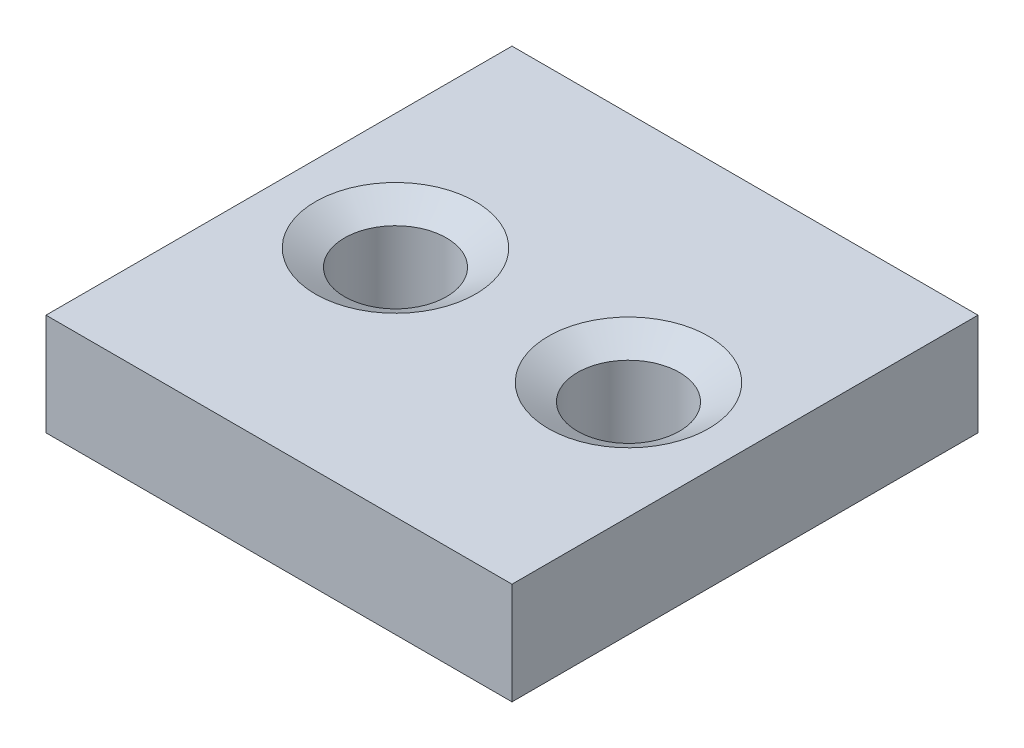
ISO-10303-21;
HEADER;
FILE_DESCRIPTION(('STEP AP214'),'2;1');
FILE_NAME('part.step','',(''),(''),'','','');
FILE_SCHEMA(('AUTOMOTIVE_DESIGN { 1 0 10303 214 1 1 1 1 }'));
ENDSEC;
DATA;
#1=APPLICATION_CONTEXT('core data for automotive mechanical design processes');
#2=APPLICATION_PROTOCOL_DEFINITION('international standard','automotive_design',2000,#1);
#3=PRODUCT_CONTEXT('',#1,'mechanical');
#4=PRODUCT('Part','Part','',(#3));
#5=PRODUCT_RELATED_PRODUCT_CATEGORY('part','',(#4));
#6=PRODUCT_DEFINITION_FORMATION('','',#4);
#7=PRODUCT_DEFINITION_CONTEXT('part definition',#1,'design');
#8=PRODUCT_DEFINITION('design','',#6,#7);
#9=PRODUCT_DEFINITION_SHAPE('','',#8);
#10=(LENGTH_UNIT() NAMED_UNIT(*) SI_UNIT(.MILLI.,.METRE.));
#11=(NAMED_UNIT(*) PLANE_ANGLE_UNIT() SI_UNIT($,.RADIAN.));
#12=(NAMED_UNIT(*) SI_UNIT($,.STERADIAN.) SOLID_ANGLE_UNIT());
#13=UNCERTAINTY_MEASURE_WITH_UNIT(LENGTH_MEASURE(1.E-05),#10,'distance_accuracy_value','');
#14=(GEOMETRIC_REPRESENTATION_CONTEXT(3) GLOBAL_UNCERTAINTY_ASSIGNED_CONTEXT((#13)) GLOBAL_UNIT_ASSIGNED_CONTEXT((#10,
#11,#12)) REPRESENTATION_CONTEXT('',''));
#15=CARTESIAN_POINT('',(0.,0.,0.));
#16=DIRECTION('',(0.,0.,1.));
#17=DIRECTION('',(1.,0.,0.));
#18=AXIS2_PLACEMENT_3D('',#15,#16,#17);
#19=CARTESIAN_POINT('',(0.,7.00000000000001,0.));
#20=DIRECTION('',(0.,1.,0.));
#21=DIRECTION('',(0.,0.,1.));
#22=AXIS2_PLACEMENT_3D('',#19,#20,#21);
#23=PLANE('',#22);
#24=CARTESIAN_POINT('',(8.00000000000001,7.00000000000001,0.));
#25=DIRECTION('',(0.,1.,0.));
#26=DIRECTION('',(0.,0.,1.));
#27=AXIS2_PLACEMENT_3D('',#24,#25,#26);
#28=CIRCLE('',#27,5.50000000000003);
#29=CARTESIAN_POINT('',(8.00000000000001,7.00000000000001,5.50000000000005));
#30=VERTEX_POINT('',#29);
#31=EDGE_CURVE('E59',#30,#30,#28,.F.);
#32=ORIENTED_EDGE('',*,*,#31,.T.);
#33=EDGE_LOOP('',(#32));
#34=FACE_BOUND('',#33,.T.);
#35=CARTESIAN_POINT('',(-8.00000000000001,7.00000000000001,0.));
#36=DIRECTION('',(0.,1.,0.));
#37=DIRECTION('',(0.,0.,1.));
#38=AXIS2_PLACEMENT_3D('',#35,#36,#37);
#39=CIRCLE('',#38,5.50000000000003);
#40=CARTESIAN_POINT('',(-8.00000000000001,7.00000000000001,5.50000000000005));
#41=VERTEX_POINT('',#40);
#42=EDGE_CURVE('E142',#41,#41,#39,.F.);
#43=ORIENTED_EDGE('',*,*,#42,.T.);
#44=EDGE_LOOP('',(#43));
#45=FACE_BOUND('',#44,.T.);
#46=DIRECTION('',(0.,0.,-1.));
#47=VECTOR('',#46,1.);
#48=CARTESIAN_POINT('',(15.9999999999988,7.00000000000001,-16.));
#49=LINE('',#48,#47);
#50=CARTESIAN_POINT('',(16.,7.00000000000001,16.));
#51=VERTEX_POINT('',#50);
#52=CARTESIAN_POINT('',(15.9999999999988,7.00000000000001,-16.));
#53=VERTEX_POINT('',#52);
#54=EDGE_CURVE('E101',#51,#53,#49,.T.);
#55=ORIENTED_EDGE('',*,*,#54,.T.);
#56=DIRECTION('',(-1.,0.,0.));
#57=VECTOR('',#56,1.);
#58=CARTESIAN_POINT('',(-16.0000000000012,7.00000000000001,-16.0000000000025));
#59=LINE('',#58,#57);
#60=CARTESIAN_POINT('',(-16.0000000000012,7.00000000000001,-16.0000000000025));
#61=VERTEX_POINT('',#60);
#62=EDGE_CURVE('E100',#53,#61,#59,.T.);
#63=ORIENTED_EDGE('',*,*,#62,.T.);
#64=DIRECTION('',(0.,0.,1.));
#65=VECTOR('',#64,1.);
#66=CARTESIAN_POINT('',(-16.0000000000012,7.00000000000001,-16.0000000000025));
#67=LINE('',#66,#65);
#68=CARTESIAN_POINT('',(-16.,7.00000000000001,15.9999999999976));
#69=VERTEX_POINT('',#68);
#70=EDGE_CURVE('E97',#61,#69,#67,.T.);
#71=ORIENTED_EDGE('',*,*,#70,.T.);
#72=DIRECTION('',(1.,0.,0.));
#73=VECTOR('',#72,1.);
#74=CARTESIAN_POINT('',(-16.,7.00000000000001,15.9999999999976));
#75=LINE('',#74,#73);
#76=EDGE_CURVE('E69',#69,#51,#75,.T.);
#77=ORIENTED_EDGE('',*,*,#76,.T.);
#78=EDGE_LOOP('',(#55,#63,#71,#77));
#79=FACE_BOUND('',#78,.T.);
#80=ADVANCED_FACE('F50',(#34,#45,#79),#23,.T.);
#81=CARTESIAN_POINT('',(0.,0.,0.));
#82=DIRECTION('',(0.,1.,0.));
#83=DIRECTION('',(0.,0.,1.));
#84=AXIS2_PLACEMENT_3D('',#81,#82,#83);
#85=PLANE('',#84);
#86=DIRECTION('',(0.,0.,-1.));
#87=VECTOR('',#86,1.);
#88=CARTESIAN_POINT('',(15.9999999999988,0.,-16.));
#89=LINE('',#88,#87);
#90=CARTESIAN_POINT('',(16.,0.,16.));
#91=VERTEX_POINT('',#90);
#92=CARTESIAN_POINT('',(15.9999999999988,0.,-16.));
#93=VERTEX_POINT('',#92);
#94=EDGE_CURVE('E124',#91,#93,#89,.T.);
#95=ORIENTED_EDGE('',*,*,#94,.F.);
#96=DIRECTION('',(1.,0.,0.));
#97=VECTOR('',#96,1.);
#98=CARTESIAN_POINT('',(-16.,0.,15.9999999999976));
#99=LINE('',#98,#97);
#100=CARTESIAN_POINT('',(-16.,0.,15.9999999999976));
#101=VERTEX_POINT('',#100);
#102=EDGE_CURVE('E90',#101,#91,#99,.T.);
#103=ORIENTED_EDGE('',*,*,#102,.F.);
#104=DIRECTION('',(0.,0.,1.));
#105=VECTOR('',#104,1.);
#106=CARTESIAN_POINT('',(-16.0000000000012,0.,-16.0000000000025));
#107=LINE('',#106,#105);
#108=CARTESIAN_POINT('',(-16.0000000000012,0.,-16.0000000000025));
#109=VERTEX_POINT('',#108);
#110=EDGE_CURVE('E83',#109,#101,#107,.T.);
#111=ORIENTED_EDGE('',*,*,#110,.F.);
#112=DIRECTION('',(-1.,0.,0.));
#113=VECTOR('',#112,1.);
#114=CARTESIAN_POINT('',(-16.0000000000012,0.,-16.0000000000025));
#115=LINE('',#114,#113);
#116=EDGE_CURVE('E110',#93,#109,#115,.T.);
#117=ORIENTED_EDGE('',*,*,#116,.F.);
#118=EDGE_LOOP('',(#95,#103,#111,#117));
#119=FACE_BOUND('',#118,.T.);
#120=CARTESIAN_POINT('',(-8.00000000000001,0.,0.));
#121=DIRECTION('',(0.,1.,0.));
#122=DIRECTION('',(0.,0.,1.));
#123=AXIS2_PLACEMENT_3D('',#120,#121,#122);
#124=CIRCLE('',#123,3.5);
#125=CARTESIAN_POINT('',(-8.00000000000001,0.,3.50000000000002));
#126=VERTEX_POINT('',#125);
#127=EDGE_CURVE('E122',#126,#126,#124,.T.);
#128=ORIENTED_EDGE('',*,*,#127,.T.);
#129=EDGE_LOOP('',(#128));
#130=FACE_BOUND('',#129,.T.);
#131=CARTESIAN_POINT('',(8.00000000000001,0.,0.));
#132=DIRECTION('',(0.,1.,0.));
#133=DIRECTION('',(0.,0.,1.));
#134=AXIS2_PLACEMENT_3D('',#131,#132,#133);
#135=CIRCLE('',#134,3.5);
#136=CARTESIAN_POINT('',(8.00000000000001,0.,3.50000000000002));
#137=VERTEX_POINT('',#136);
#138=EDGE_CURVE('E163',#137,#137,#135,.T.);
#139=ORIENTED_EDGE('',*,*,#138,.T.);
#140=EDGE_LOOP('',(#139));
#141=FACE_BOUND('',#140,.T.);
#142=ADVANCED_FACE('F185',(#119,#130,#141),#85,.F.);
#143=CARTESIAN_POINT('',(15.9999999999988,7.00000000000001,-16.));
#144=DIRECTION('',(-1.,0.,0.));
#145=DIRECTION('',(0.,0.,1.));
#146=AXIS2_PLACEMENT_3D('',#143,#144,#145);
#147=PLANE('',#146);
#148=ORIENTED_EDGE('',*,*,#94,.T.);
#149=DIRECTION('',(0.,-1.,0.));
#150=VECTOR('',#149,1.);
#151=CARTESIAN_POINT('',(15.9999999999988,7.00000000000001,-16.));
#152=LINE('',#151,#150);
#153=EDGE_CURVE('E108',#53,#93,#152,.T.);
#154=ORIENTED_EDGE('',*,*,#153,.F.);
#155=ORIENTED_EDGE('',*,*,#54,.F.);
#156=DIRECTION('',(0.,-1.,0.));
#157=VECTOR('',#156,1.);
#158=CARTESIAN_POINT('',(16.,7.00000000000001,16.));
#159=LINE('',#158,#157);
#160=EDGE_CURVE('E120',#51,#91,#159,.T.);
#161=ORIENTED_EDGE('',*,*,#160,.T.);
#162=EDGE_LOOP('',(#148,#154,#155,#161));
#163=FACE_BOUND('',#162,.T.);
#164=ADVANCED_FACE('F200',(#163),#147,.F.);
#165=CARTESIAN_POINT('',(-16.0000000000012,7.00000000000001,-16.0000000000025));
#166=DIRECTION('',(0.,0.,1.));
#167=DIRECTION('',(1.,0.,0.));
#168=AXIS2_PLACEMENT_3D('',#165,#166,#167);
#169=PLANE('',#168);
#170=ORIENTED_EDGE('',*,*,#116,.T.);
#171=DIRECTION('',(0.,-1.,0.));
#172=VECTOR('',#171,1.);
#173=CARTESIAN_POINT('',(-16.0000000000012,7.00000000000001,-16.0000000000025));
#174=LINE('',#173,#172);
#175=EDGE_CURVE('E104',#61,#109,#174,.T.);
#176=ORIENTED_EDGE('',*,*,#175,.F.);
#177=ORIENTED_EDGE('',*,*,#62,.F.);
#178=ORIENTED_EDGE('',*,*,#153,.T.);
#179=EDGE_LOOP('',(#170,#176,#177,#178));
#180=FACE_BOUND('',#179,.T.);
#181=ADVANCED_FACE('F106',(#180),#169,.F.);
#182=CARTESIAN_POINT('',(-16.0000000000012,7.00000000000001,-16.0000000000025));
#183=DIRECTION('',(1.,0.,0.));
#184=DIRECTION('',(0.,0.,-1.));
#185=AXIS2_PLACEMENT_3D('',#182,#183,#184);
#186=PLANE('',#185);
#187=ORIENTED_EDGE('',*,*,#110,.T.);
#188=DIRECTION('',(0.,-1.,0.));
#189=VECTOR('',#188,1.);
#190=CARTESIAN_POINT('',(-16.,7.00000000000001,15.9999999999976));
#191=LINE('',#190,#189);
#192=EDGE_CURVE('E109',#69,#101,#191,.T.);
#193=ORIENTED_EDGE('',*,*,#192,.F.);
#194=ORIENTED_EDGE('',*,*,#70,.F.);
#195=ORIENTED_EDGE('',*,*,#175,.T.);
#196=EDGE_LOOP('',(#187,#193,#194,#195));
#197=FACE_BOUND('',#196,.T.);
#198=ADVANCED_FACE('F115',(#197),#186,.F.);
#199=CARTESIAN_POINT('',(-16.,7.00000000000001,15.9999999999976));
#200=DIRECTION('',(0.,0.,-1.));
#201=DIRECTION('',(-1.,0.,0.));
#202=AXIS2_PLACEMENT_3D('',#199,#200,#201);
#203=PLANE('',#202);
#204=ORIENTED_EDGE('',*,*,#102,.T.);
#205=ORIENTED_EDGE('',*,*,#160,.F.);
#206=ORIENTED_EDGE('',*,*,#76,.F.);
#207=ORIENTED_EDGE('',*,*,#192,.T.);
#208=EDGE_LOOP('',(#204,#205,#206,#207));
#209=FACE_BOUND('',#208,.T.);
#210=ADVANCED_FACE('F183',(#209),#203,.F.);
#211=CARTESIAN_POINT('',(-8.00000000000001,7.00000000000001,0.));
#212=DIRECTION('',(0.,-1.,0.));
#213=DIRECTION('',(0.,0.,-1.));
#214=AXIS2_PLACEMENT_3D('',#211,#212,#213);
#215=CYLINDRICAL_SURFACE('',#214,3.5);
#216=CARTESIAN_POINT('',(-8.00000000000001,5.84529946162071,0.));
#217=DIRECTION('',(0.,1.,0.));
#218=DIRECTION('',(0.,0.,1.));
#219=AXIS2_PLACEMENT_3D('',#216,#217,#218);
#220=CIRCLE('',#219,3.5);
#221=CARTESIAN_POINT('',(-8.00000000000001,5.84529946162071,3.50000000000002));
#222=VERTEX_POINT('',#221);
#223=EDGE_CURVE('E12',#222,#222,#220,.T.);
#224=ORIENTED_EDGE('',*,*,#223,.T.);
#225=EDGE_LOOP('',(#224));
#226=FACE_BOUND('',#225,.T.);
#227=ORIENTED_EDGE('',*,*,#127,.F.);
#228=EDGE_LOOP('',(#227));
#229=FACE_BOUND('',#228,.T.);
#230=ADVANCED_FACE('F159',(#226,#229),#215,.F.);
#231=CARTESIAN_POINT('',(8.00000000000001,7.00000000000001,0.));
#232=DIRECTION('',(0.,-1.,0.));
#233=DIRECTION('',(0.,0.,-1.));
#234=AXIS2_PLACEMENT_3D('',#231,#232,#233);
#235=CYLINDRICAL_SURFACE('',#234,3.5);
#236=CARTESIAN_POINT('',(8.00000000000001,5.84529946162071,0.));
#237=DIRECTION('',(0.,1.,0.));
#238=DIRECTION('',(0.,0.,1.));
#239=AXIS2_PLACEMENT_3D('',#236,#237,#238);
#240=CIRCLE('',#239,3.5);
#241=CARTESIAN_POINT('',(8.00000000000001,5.84529946162071,3.50000000000002));
#242=VERTEX_POINT('',#241);
#243=EDGE_CURVE('E138',#242,#242,#240,.T.);
#244=ORIENTED_EDGE('',*,*,#243,.T.);
#245=EDGE_LOOP('',(#244));
#246=FACE_BOUND('',#245,.T.);
#247=ORIENTED_EDGE('',*,*,#138,.F.);
#248=EDGE_LOOP('',(#247));
#249=FACE_BOUND('',#248,.T.);
#250=ADVANCED_FACE('F154',(#246,#249),#235,.F.);
#251=CARTESIAN_POINT('',(8.00000000000001,5.84529946162071,0.));
#252=DIRECTION('',(0.,1.,0.));
#253=DIRECTION('',(0.,0.,1.));
#254=AXIS2_PLACEMENT_3D('',#251,#252,#253);
#255=CONICAL_SURFACE('',#254,3.5,1.0471975511966);
#256=ORIENTED_EDGE('',*,*,#31,.F.);
#257=EDGE_LOOP('',(#256));
#258=FACE_BOUND('',#257,.T.);
#259=ORIENTED_EDGE('',*,*,#243,.F.);
#260=EDGE_LOOP('',(#259));
#261=FACE_BOUND('',#260,.T.);
#262=ADVANCED_FACE('F155',(#258,#261),#255,.F.);
#263=CARTESIAN_POINT('',(-8.00000000000001,5.84529946162071,0.));
#264=DIRECTION('',(0.,1.,0.));
#265=DIRECTION('',(0.,0.,1.));
#266=AXIS2_PLACEMENT_3D('',#263,#264,#265);
#267=CONICAL_SURFACE('',#266,3.5,1.0471975511966);
#268=ORIENTED_EDGE('',*,*,#42,.F.);
#269=EDGE_LOOP('',(#268));
#270=FACE_BOUND('',#269,.T.);
#271=ORIENTED_EDGE('',*,*,#223,.F.);
#272=EDGE_LOOP('',(#271));
#273=FACE_BOUND('',#272,.T.);
#274=ADVANCED_FACE('F49',(#270,#273),#267,.F.);
#275=CLOSED_SHELL('',(#80,#142,#164,#181,#198,#210,#230,#250,#262,#274));
#276=MANIFOLD_SOLID_BREP('B2',#275);
#277=ADVANCED_BREP_SHAPE_REPRESENTATION('',(#18,#276),#14);
#278=SHAPE_DEFINITION_REPRESENTATION(#9,#277);
ENDSEC;
END-ISO-10303-21;
